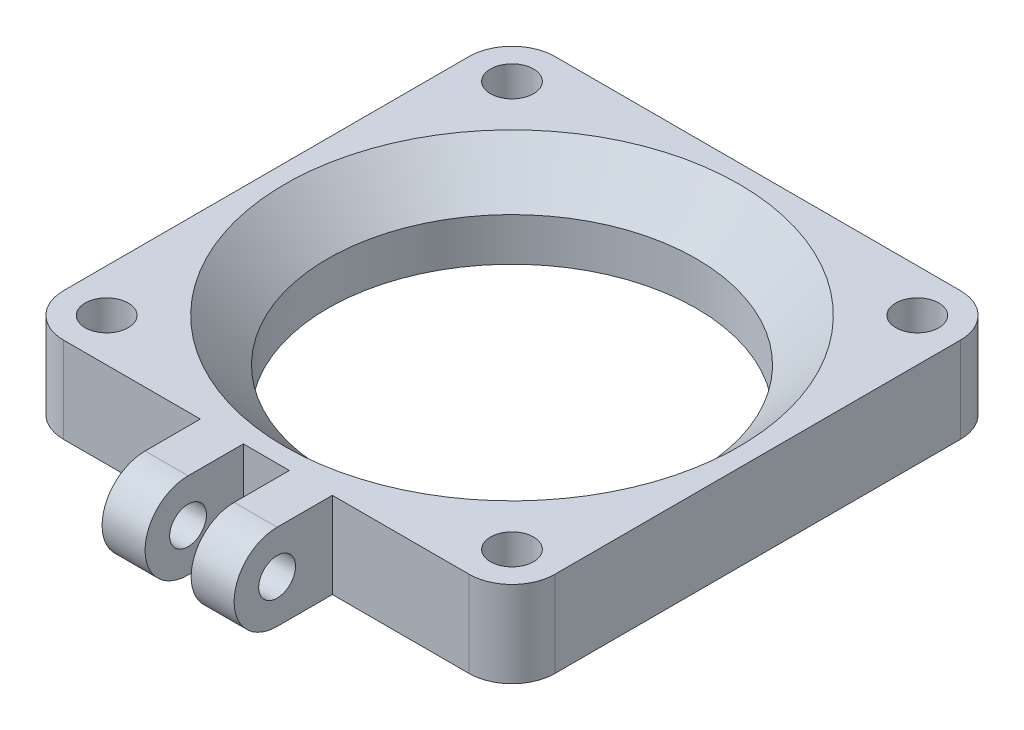
ISO-10303-21;
HEADER;
FILE_DESCRIPTION(('STEP AP214'),'2;1');
FILE_NAME('part.step','',(''),(''),'','','');
FILE_SCHEMA(('AUTOMOTIVE_DESIGN { 1 0 10303 214 1 1 1 1 }'));
ENDSEC;
DATA;
#1=APPLICATION_CONTEXT('core data for automotive mechanical design processes');
#2=APPLICATION_PROTOCOL_DEFINITION('international standard','automotive_design',2000,#1);
#3=PRODUCT_CONTEXT('',#1,'mechanical');
#4=PRODUCT('Part','Part','',(#3));
#5=PRODUCT_RELATED_PRODUCT_CATEGORY('part','',(#4));
#6=PRODUCT_DEFINITION_FORMATION('','',#4);
#7=PRODUCT_DEFINITION_CONTEXT('part definition',#1,'design');
#8=PRODUCT_DEFINITION('design','',#6,#7);
#9=PRODUCT_DEFINITION_SHAPE('','',#8);
#10=(LENGTH_UNIT() NAMED_UNIT(*) SI_UNIT(.MILLI.,.METRE.));
#11=(NAMED_UNIT(*) PLANE_ANGLE_UNIT() SI_UNIT($,.RADIAN.));
#12=(NAMED_UNIT(*) SI_UNIT($,.STERADIAN.) SOLID_ANGLE_UNIT());
#13=UNCERTAINTY_MEASURE_WITH_UNIT(LENGTH_MEASURE(1.E-05),#10,'distance_accuracy_value','');
#14=(GEOMETRIC_REPRESENTATION_CONTEXT(3) GLOBAL_UNCERTAINTY_ASSIGNED_CONTEXT((#13)) GLOBAL_UNIT_ASSIGNED_CONTEXT((#10,
#11,#12)) REPRESENTATION_CONTEXT('',''));
#15=CARTESIAN_POINT('',(0.,0.,0.));
#16=DIRECTION('',(0.,0.,1.));
#17=DIRECTION('',(1.,0.,0.));
#18=AXIS2_PLACEMENT_3D('',#15,#16,#17);
#19=CARTESIAN_POINT('',(-16.5,7.,16.5));
#20=DIRECTION('',(0.,1.,0.));
#21=DIRECTION('',(0.,0.,1.));
#22=AXIS2_PLACEMENT_3D('',#19,#20,#21);
#23=PLANE('',#22);
#24=DIRECTION('',(0.,0.,-1.));
#25=VECTOR('',#24,1.);
#26=CARTESIAN_POINT('',(-5.375,7.,0.));
#27=LINE('',#26,#25);
#28=CARTESIAN_POINT('',(-5.375,7.,24.5));
#29=VERTEX_POINT('',#28);
#30=CARTESIAN_POINT('',(-5.375,7.,20.));
#31=VERTEX_POINT('',#30);
#32=EDGE_CURVE('E212',#29,#31,#27,.T.);
#33=ORIENTED_EDGE('',*,*,#32,.F.);
#34=DIRECTION('',(1.,0.,0.));
#35=VECTOR('',#34,1.);
#36=CARTESIAN_POINT('',(-20.,7.,24.5));
#37=LINE('',#36,#35);
#38=CARTESIAN_POINT('',(-1.875,7.,24.5));
#39=VERTEX_POINT('',#38);
#40=EDGE_CURVE('E597',#29,#39,#37,.T.);
#41=ORIENTED_EDGE('',*,*,#40,.T.);
#42=DIRECTION('',(0.,0.,1.));
#43=VECTOR('',#42,1.);
#44=CARTESIAN_POINT('',(-1.875,7.,0.));
#45=LINE('',#44,#43);
#46=CARTESIAN_POINT('',(-1.875,7.,20.));
#47=VERTEX_POINT('',#46);
#48=EDGE_CURVE('E209',#47,#39,#45,.T.);
#49=ORIENTED_EDGE('',*,*,#48,.F.);
#50=DIRECTION('',(1.,0.,0.));
#51=VECTOR('',#50,1.);
#52=CARTESIAN_POINT('',(-16.5,7.,20.));
#53=LINE('',#52,#51);
#54=CARTESIAN_POINT('',(1.875,7.,20.));
#55=VERTEX_POINT('',#54);
#56=EDGE_CURVE('E257',#47,#55,#53,.T.);
#57=ORIENTED_EDGE('',*,*,#56,.T.);
#58=DIRECTION('',(0.,0.,-1.));
#59=VECTOR('',#58,1.);
#60=CARTESIAN_POINT('',(1.875,7.,0.));
#61=LINE('',#60,#59);
#62=CARTESIAN_POINT('',(1.875,7.,24.5));
#63=VERTEX_POINT('',#62);
#64=EDGE_CURVE('E78',#63,#55,#61,.T.);
#65=ORIENTED_EDGE('',*,*,#64,.F.);
#66=CARTESIAN_POINT('',(5.375,7.,24.5));
#67=VERTEX_POINT('',#66);
#68=EDGE_CURVE('E180',#63,#67,#37,.T.);
#69=ORIENTED_EDGE('',*,*,#68,.T.);
#70=DIRECTION('',(0.,0.,1.));
#71=VECTOR('',#70,1.);
#72=CARTESIAN_POINT('',(5.375,7.,0.));
#73=LINE('',#72,#71);
#74=CARTESIAN_POINT('',(5.375,7.,20.));
#75=VERTEX_POINT('',#74);
#76=EDGE_CURVE('E177',#75,#67,#73,.T.);
#77=ORIENTED_EDGE('',*,*,#76,.F.);
#78=CARTESIAN_POINT('',(16.5,7.,20.));
#79=VERTEX_POINT('',#78);
#80=EDGE_CURVE('E70',#75,#79,#53,.T.);
#81=ORIENTED_EDGE('',*,*,#80,.T.);
#82=CARTESIAN_POINT('',(16.5,7.,16.5));
#83=DIRECTION('',(0.,1.,0.));
#84=DIRECTION('',(0.,0.,1.));
#85=AXIS2_PLACEMENT_3D('',#82,#83,#84);
#86=CIRCLE('',#85,3.5);
#87=CARTESIAN_POINT('',(20.,7.,16.5));
#88=VERTEX_POINT('',#87);
#89=EDGE_CURVE('E256',#79,#88,#86,.T.);
#90=ORIENTED_EDGE('',*,*,#89,.T.);
#91=DIRECTION('',(0.,0.,-1.));
#92=VECTOR('',#91,1.);
#93=CARTESIAN_POINT('',(20.,7.,-16.5));
#94=LINE('',#93,#92);
#95=CARTESIAN_POINT('',(20.,7.,-16.5));
#96=VERTEX_POINT('',#95);
#97=EDGE_CURVE('E259',#88,#96,#94,.T.);
#98=ORIENTED_EDGE('',*,*,#97,.T.);
#99=CARTESIAN_POINT('',(16.5,7.,-16.5));
#100=DIRECTION('',(0.,1.,0.));
#101=DIRECTION('',(0.,0.,-1.));
#102=AXIS2_PLACEMENT_3D('',#99,#100,#101);
#103=CIRCLE('',#102,3.49999999999999);
#104=CARTESIAN_POINT('',(16.5,7.,-20.));
#105=VERTEX_POINT('',#104);
#106=EDGE_CURVE('E261',#96,#105,#103,.T.);
#107=ORIENTED_EDGE('',*,*,#106,.T.);
#108=DIRECTION('',(-1.,0.,0.));
#109=VECTOR('',#108,1.);
#110=CARTESIAN_POINT('',(-16.5,7.,-20.));
#111=LINE('',#110,#109);
#112=CARTESIAN_POINT('',(-16.5,7.,-20.));
#113=VERTEX_POINT('',#112);
#114=EDGE_CURVE('E263',#105,#113,#111,.T.);
#115=ORIENTED_EDGE('',*,*,#114,.T.);
#116=CARTESIAN_POINT('',(-16.5,7.,-16.5));
#117=DIRECTION('',(0.,1.,0.));
#118=DIRECTION('',(0.,0.,1.));
#119=AXIS2_PLACEMENT_3D('',#116,#117,#118);
#120=CIRCLE('',#119,3.5);
#121=CARTESIAN_POINT('',(-20.,7.,-16.5));
#122=VERTEX_POINT('',#121);
#123=EDGE_CURVE('E265',#113,#122,#120,.T.);
#124=ORIENTED_EDGE('',*,*,#123,.T.);
#125=DIRECTION('',(0.,0.,1.));
#126=VECTOR('',#125,1.);
#127=CARTESIAN_POINT('',(-20.,7.,-16.5));
#128=LINE('',#127,#126);
#129=CARTESIAN_POINT('',(-20.,7.,16.5));
#130=VERTEX_POINT('',#129);
#131=EDGE_CURVE('E267',#122,#130,#128,.T.);
#132=ORIENTED_EDGE('',*,*,#131,.T.);
#133=CARTESIAN_POINT('',(-16.5,7.,16.5));
#134=DIRECTION('',(0.,1.,0.));
#135=DIRECTION('',(0.,0.,1.));
#136=AXIS2_PLACEMENT_3D('',#133,#134,#135);
#137=CIRCLE('',#136,3.5);
#138=CARTESIAN_POINT('',(-16.5,7.,20.));
#139=VERTEX_POINT('',#138);
#140=EDGE_CURVE('E249',#130,#139,#137,.T.);
#141=ORIENTED_EDGE('',*,*,#140,.T.);
#142=EDGE_CURVE('E253',#139,#31,#53,.T.);
#143=ORIENTED_EDGE('',*,*,#142,.T.);
#144=EDGE_LOOP('',(#33,#41,#49,#57,#65,#69,#77,#81,#90,#98,#107,#115,#124,#132,#141,#143));
#145=FACE_BOUND('',#144,.T.);
#146=CARTESIAN_POINT('',(-16.5,7.,-16.5));
#147=DIRECTION('',(0.,1.,0.));
#148=DIRECTION('',(0.,0.,1.));
#149=AXIS2_PLACEMENT_3D('',#146,#147,#148);
#150=CIRCLE('',#149,1.75);
#151=CARTESIAN_POINT('',(-16.5,7.,-14.75));
#152=VERTEX_POINT('',#151);
#153=EDGE_CURVE('E242',#152,#152,#150,.T.);
#154=ORIENTED_EDGE('',*,*,#153,.F.);
#155=EDGE_LOOP('',(#154));
#156=FACE_BOUND('',#155,.T.);
#157=CARTESIAN_POINT('',(16.5,7.,-16.5));
#158=DIRECTION('',(0.,1.,0.));
#159=DIRECTION('',(0.,0.,-1.));
#160=AXIS2_PLACEMENT_3D('',#157,#158,#159);
#161=CIRCLE('',#160,1.75);
#162=CARTESIAN_POINT('',(16.5,7.,-18.25));
#163=VERTEX_POINT('',#162);
#164=EDGE_CURVE('E236',#163,#163,#161,.T.);
#165=ORIENTED_EDGE('',*,*,#164,.F.);
#166=EDGE_LOOP('',(#165));
#167=FACE_BOUND('',#166,.T.);
#168=CARTESIAN_POINT('',(16.5,7.,16.5));
#169=DIRECTION('',(0.,1.,0.));
#170=DIRECTION('',(0.,0.,1.));
#171=AXIS2_PLACEMENT_3D('',#168,#169,#170);
#172=CIRCLE('',#171,1.75);
#173=CARTESIAN_POINT('',(16.5,7.,18.25));
#174=VERTEX_POINT('',#173);
#175=EDGE_CURVE('E230',#174,#174,#172,.T.);
#176=ORIENTED_EDGE('',*,*,#175,.F.);
#177=EDGE_LOOP('',(#176));
#178=FACE_BOUND('',#177,.T.);
#179=CARTESIAN_POINT('',(-16.5,7.,16.5));
#180=DIRECTION('',(0.,1.,0.));
#181=DIRECTION('',(0.,0.,-1.));
#182=AXIS2_PLACEMENT_3D('',#179,#180,#181);
#183=CIRCLE('',#182,1.75);
#184=CARTESIAN_POINT('',(-16.5,7.,14.75));
#185=VERTEX_POINT('',#184);
#186=EDGE_CURVE('E224',#185,#185,#183,.T.);
#187=ORIENTED_EDGE('',*,*,#186,.F.);
#188=EDGE_LOOP('',(#187));
#189=FACE_BOUND('',#188,.T.);
#190=CARTESIAN_POINT('',(0.,7.,0.));
#191=DIRECTION('',(0.,1.,0.));
#192=DIRECTION('',(0.,0.,1.));
#193=AXIS2_PLACEMENT_3D('',#190,#191,#192);
#194=CIRCLE('',#193,18.5);
#195=CARTESIAN_POINT('',(0.,7.,18.5));
#196=VERTEX_POINT('',#195);
#197=EDGE_CURVE('E619',#196,#196,#194,.T.);
#198=ORIENTED_EDGE('',*,*,#197,.F.);
#199=EDGE_LOOP('',(#198));
#200=FACE_BOUND('',#199,.T.);
#201=ADVANCED_FACE('F55',(#145,#156,#167,#178,#189,#200),#23,.T.);
#202=CARTESIAN_POINT('',(0.,7.,0.));
#203=DIRECTION('',(0.,-1.,0.));
#204=DIRECTION('',(0.,0.,-1.));
#205=AXIS2_PLACEMENT_3D('',#202,#203,#204);
#206=CYLINDRICAL_SURFACE('',#205,15.);
#207=CARTESIAN_POINT('',(0.,0.,0.));
#208=DIRECTION('',(0.,-1.,0.));
#209=DIRECTION('',(0.,0.,-1.));
#210=AXIS2_PLACEMENT_3D('',#207,#208,#209);
#211=CIRCLE('',#210,15.);
#212=CARTESIAN_POINT('',(0.,0.,-15.));
#213=VERTEX_POINT('',#212);
#214=EDGE_CURVE('E616',#213,#213,#211,.T.);
#215=ORIENTED_EDGE('',*,*,#214,.T.);
#216=EDGE_LOOP('',(#215));
#217=FACE_BOUND('',#216,.T.);
#218=CARTESIAN_POINT('',(0.,3.5,0.));
#219=DIRECTION('',(0.,1.,0.));
#220=DIRECTION('',(0.,0.,1.));
#221=AXIS2_PLACEMENT_3D('',#218,#219,#220);
#222=CIRCLE('',#221,15.);
#223=CARTESIAN_POINT('',(0.,3.5,15.));
#224=VERTEX_POINT('',#223);
#225=EDGE_CURVE('E622',#224,#224,#222,.T.);
#226=ORIENTED_EDGE('',*,*,#225,.T.);
#227=EDGE_LOOP('',(#226));
#228=FACE_BOUND('',#227,.T.);
#229=ADVANCED_FACE('F348',(#217,#228),#206,.F.);
#230=CARTESIAN_POINT('',(-1.875,7.,0.));
#231=DIRECTION('',(1.,0.,0.));
#232=DIRECTION('',(0.,0.,-1.));
#233=AXIS2_PLACEMENT_3D('',#230,#231,#232);
#234=PLANE('',#233);
#235=CARTESIAN_POINT('',(-1.875,3.5,24.5));
#236=DIRECTION('',(1.,0.,0.));
#237=DIRECTION('',(0.,0.,-1.));
#238=AXIS2_PLACEMENT_3D('',#235,#236,#237);
#239=CIRCLE('',#238,1.5);
#240=CARTESIAN_POINT('',(-1.875,3.5,23.));
#241=VERTEX_POINT('',#240);
#242=EDGE_CURVE('E189',#241,#241,#239,.T.);
#243=ORIENTED_EDGE('',*,*,#242,.F.);
#244=EDGE_LOOP('',(#243));
#245=FACE_BOUND('',#244,.T.);
#246=CARTESIAN_POINT('',(-1.875,3.5,24.5));
#247=DIRECTION('',(1.,0.,0.));
#248=DIRECTION('',(0.,0.,-1.));
#249=AXIS2_PLACEMENT_3D('',#246,#247,#248);
#250=CIRCLE('',#249,3.5);
#251=CARTESIAN_POINT('',(-1.875,0.,24.5));
#252=VERTEX_POINT('',#251);
#253=EDGE_CURVE('E196',#39,#252,#250,.T.);
#254=ORIENTED_EDGE('',*,*,#253,.T.);
#255=DIRECTION('',(0.,0.,1.));
#256=VECTOR('',#255,1.);
#257=CARTESIAN_POINT('',(-1.875,0.,0.));
#258=LINE('',#257,#256);
#259=CARTESIAN_POINT('',(-1.875,0.,20.));
#260=VERTEX_POINT('',#259);
#261=EDGE_CURVE('E208',#260,#252,#258,.T.);
#262=ORIENTED_EDGE('',*,*,#261,.F.);
#263=DIRECTION('',(0.,-1.,0.));
#264=VECTOR('',#263,1.);
#265=CARTESIAN_POINT('',(-1.875,7.,20.));
#266=LINE('',#265,#264);
#267=EDGE_CURVE('E221',#47,#260,#266,.T.);
#268=ORIENTED_EDGE('',*,*,#267,.F.);
#269=ORIENTED_EDGE('',*,*,#48,.T.);
#270=EDGE_LOOP('',(#254,#262,#268,#269));
#271=FACE_BOUND('',#270,.T.);
#272=ADVANCED_FACE('F333',(#245,#271),#234,.T.);
#273=CARTESIAN_POINT('',(-5.375,7.,0.));
#274=DIRECTION('',(-1.,0.,0.));
#275=DIRECTION('',(0.,0.,1.));
#276=AXIS2_PLACEMENT_3D('',#273,#274,#275);
#277=PLANE('',#276);
#278=CARTESIAN_POINT('',(-5.375,3.5,24.5));
#279=DIRECTION('',(-1.,0.,0.));
#280=DIRECTION('',(0.,0.,1.));
#281=AXIS2_PLACEMENT_3D('',#278,#279,#280);
#282=CIRCLE('',#281,1.5);
#283=CARTESIAN_POINT('',(-5.375,3.5,26.));
#284=VERTEX_POINT('',#283);
#285=EDGE_CURVE('E589',#284,#284,#282,.T.);
#286=ORIENTED_EDGE('',*,*,#285,.F.);
#287=EDGE_LOOP('',(#286));
#288=FACE_BOUND('',#287,.T.);
#289=DIRECTION('',(0.,0.,-1.));
#290=VECTOR('',#289,1.);
#291=CARTESIAN_POINT('',(-5.375,0.,0.));
#292=LINE('',#291,#290);
#293=CARTESIAN_POINT('',(-5.375,0.,24.5));
#294=VERTEX_POINT('',#293);
#295=CARTESIAN_POINT('',(-5.375,0.,20.));
#296=VERTEX_POINT('',#295);
#297=EDGE_CURVE('E213',#294,#296,#292,.T.);
#298=ORIENTED_EDGE('',*,*,#297,.F.);
#299=CARTESIAN_POINT('',(-5.375,3.5,24.5));
#300=DIRECTION('',(-1.,0.,0.));
#301=DIRECTION('',(0.,0.,1.));
#302=AXIS2_PLACEMENT_3D('',#299,#300,#301);
#303=CIRCLE('',#302,3.5);
#304=EDGE_CURVE('E199',#294,#29,#303,.T.);
#305=ORIENTED_EDGE('',*,*,#304,.T.);
#306=ORIENTED_EDGE('',*,*,#32,.T.);
#307=DIRECTION('',(0.,1.,0.));
#308=VECTOR('',#307,1.);
#309=CARTESIAN_POINT('',(-5.375,7.,20.));
#310=LINE('',#309,#308);
#311=EDGE_CURVE('E215',#296,#31,#310,.T.);
#312=ORIENTED_EDGE('',*,*,#311,.F.);
#313=EDGE_LOOP('',(#298,#305,#306,#312));
#314=FACE_BOUND('',#313,.T.);
#315=ADVANCED_FACE('F549',(#288,#314),#277,.T.);
#316=CARTESIAN_POINT('',(1.875,7.,0.));
#317=DIRECTION('',(-1.,0.,0.));
#318=DIRECTION('',(0.,0.,1.));
#319=AXIS2_PLACEMENT_3D('',#316,#317,#318);
#320=PLANE('',#319);
#321=CARTESIAN_POINT('',(1.875,3.5,24.5));
#322=DIRECTION('',(-1.,0.,0.));
#323=DIRECTION('',(0.,0.,1.));
#324=AXIS2_PLACEMENT_3D('',#321,#322,#323);
#325=CIRCLE('',#324,1.5);
#326=CARTESIAN_POINT('',(1.875,3.5,26.));
#327=VERTEX_POINT('',#326);
#328=EDGE_CURVE('E592',#327,#327,#325,.T.);
#329=ORIENTED_EDGE('',*,*,#328,.F.);
#330=EDGE_LOOP('',(#329));
#331=FACE_BOUND('',#330,.T.);
#332=DIRECTION('',(0.,0.,-1.));
#333=VECTOR('',#332,1.);
#334=CARTESIAN_POINT('',(1.875,0.,0.));
#335=LINE('',#334,#333);
#336=CARTESIAN_POINT('',(1.875,0.,24.5));
#337=VERTEX_POINT('',#336);
#338=CARTESIAN_POINT('',(1.875,0.,20.));
#339=VERTEX_POINT('',#338);
#340=EDGE_CURVE('E195',#337,#339,#335,.T.);
#341=ORIENTED_EDGE('',*,*,#340,.F.);
#342=CARTESIAN_POINT('',(1.875,3.5,24.5));
#343=DIRECTION('',(-1.,0.,0.));
#344=DIRECTION('',(0.,0.,1.));
#345=AXIS2_PLACEMENT_3D('',#342,#343,#344);
#346=CIRCLE('',#345,3.5);
#347=EDGE_CURVE('E186',#337,#63,#346,.T.);
#348=ORIENTED_EDGE('',*,*,#347,.T.);
#349=ORIENTED_EDGE('',*,*,#64,.T.);
#350=DIRECTION('',(0.,1.,0.));
#351=VECTOR('',#350,1.);
#352=CARTESIAN_POINT('',(1.875,7.,20.));
#353=LINE('',#352,#351);
#354=EDGE_CURVE('E206',#339,#55,#353,.T.);
#355=ORIENTED_EDGE('',*,*,#354,.F.);
#356=EDGE_LOOP('',(#341,#348,#349,#355));
#357=FACE_BOUND('',#356,.T.);
#358=ADVANCED_FACE('F542',(#331,#357),#320,.T.);
#359=CARTESIAN_POINT('',(5.375,7.,0.));
#360=DIRECTION('',(1.,0.,0.));
#361=DIRECTION('',(0.,0.,-1.));
#362=AXIS2_PLACEMENT_3D('',#359,#360,#361);
#363=PLANE('',#362);
#364=CARTESIAN_POINT('',(5.375,3.5,24.5));
#365=DIRECTION('',(1.,0.,0.));
#366=DIRECTION('',(0.,0.,-1.));
#367=AXIS2_PLACEMENT_3D('',#364,#365,#366);
#368=CIRCLE('',#367,1.5);
#369=CARTESIAN_POINT('',(5.375,3.5,23.));
#370=VERTEX_POINT('',#369);
#371=EDGE_CURVE('E613',#370,#370,#368,.T.);
#372=ORIENTED_EDGE('',*,*,#371,.F.);
#373=EDGE_LOOP('',(#372));
#374=FACE_BOUND('',#373,.T.);
#375=CARTESIAN_POINT('',(5.375,3.5,24.5));
#376=DIRECTION('',(1.,0.,0.));
#377=DIRECTION('',(0.,0.,-1.));
#378=AXIS2_PLACEMENT_3D('',#375,#376,#377);
#379=CIRCLE('',#378,3.5);
#380=CARTESIAN_POINT('',(5.375,0.,24.5));
#381=VERTEX_POINT('',#380);
#382=EDGE_CURVE('E171',#67,#381,#379,.T.);
#383=ORIENTED_EDGE('',*,*,#382,.T.);
#384=DIRECTION('',(0.,0.,1.));
#385=VECTOR('',#384,1.);
#386=CARTESIAN_POINT('',(5.375,0.,0.));
#387=LINE('',#386,#385);
#388=CARTESIAN_POINT('',(5.375,0.,20.));
#389=VERTEX_POINT('',#388);
#390=EDGE_CURVE('E175',#389,#381,#387,.T.);
#391=ORIENTED_EDGE('',*,*,#390,.F.);
#392=DIRECTION('',(0.,-1.,0.));
#393=VECTOR('',#392,1.);
#394=CARTESIAN_POINT('',(5.375,7.,20.));
#395=LINE('',#394,#393);
#396=EDGE_CURVE('E204',#75,#389,#395,.T.);
#397=ORIENTED_EDGE('',*,*,#396,.F.);
#398=ORIENTED_EDGE('',*,*,#76,.T.);
#399=EDGE_LOOP('',(#383,#391,#397,#398));
#400=FACE_BOUND('',#399,.T.);
#401=ADVANCED_FACE('F173',(#374,#400),#363,.T.);
#402=CARTESIAN_POINT('',(-16.5,0.,16.5));
#403=DIRECTION('',(0.,1.,0.));
#404=DIRECTION('',(0.,0.,1.));
#405=AXIS2_PLACEMENT_3D('',#402,#403,#404);
#406=PLANE('',#405);
#407=ORIENTED_EDGE('',*,*,#214,.F.);
#408=EDGE_LOOP('',(#407));
#409=FACE_BOUND('',#408,.T.);
#410=CARTESIAN_POINT('',(-16.5,0.,16.5));
#411=DIRECTION('',(0.,1.,0.));
#412=DIRECTION('',(0.,0.,1.));
#413=AXIS2_PLACEMENT_3D('',#410,#411,#412);
#414=CIRCLE('',#413,1.75);
#415=CARTESIAN_POINT('',(-16.5,0.,18.25));
#416=VERTEX_POINT('',#415);
#417=EDGE_CURVE('E227',#416,#416,#414,.F.);
#418=ORIENTED_EDGE('',*,*,#417,.F.);
#419=EDGE_LOOP('',(#418));
#420=FACE_BOUND('',#419,.T.);
#421=CARTESIAN_POINT('',(16.5,0.,16.5));
#422=DIRECTION('',(0.,1.,0.));
#423=DIRECTION('',(0.,0.,1.));
#424=AXIS2_PLACEMENT_3D('',#421,#422,#423);
#425=CIRCLE('',#424,1.75);
#426=CARTESIAN_POINT('',(16.5,0.,18.25));
#427=VERTEX_POINT('',#426);
#428=EDGE_CURVE('E233',#427,#427,#425,.F.);
#429=ORIENTED_EDGE('',*,*,#428,.F.);
#430=EDGE_LOOP('',(#429));
#431=FACE_BOUND('',#430,.T.);
#432=CARTESIAN_POINT('',(16.5,0.,-16.5));
#433=DIRECTION('',(0.,1.,0.));
#434=DIRECTION('',(0.,0.,1.));
#435=AXIS2_PLACEMENT_3D('',#432,#433,#434);
#436=CIRCLE('',#435,1.75);
#437=CARTESIAN_POINT('',(16.5,0.,-14.75));
#438=VERTEX_POINT('',#437);
#439=EDGE_CURVE('E239',#438,#438,#436,.F.);
#440=ORIENTED_EDGE('',*,*,#439,.F.);
#441=EDGE_LOOP('',(#440));
#442=FACE_BOUND('',#441,.T.);
#443=CARTESIAN_POINT('',(-16.5,0.,-16.5));
#444=DIRECTION('',(0.,1.,0.));
#445=DIRECTION('',(0.,0.,1.));
#446=AXIS2_PLACEMENT_3D('',#443,#444,#445);
#447=CIRCLE('',#446,1.75);
#448=CARTESIAN_POINT('',(-16.5,0.,-14.75));
#449=VERTEX_POINT('',#448);
#450=EDGE_CURVE('E245',#449,#449,#447,.F.);
#451=ORIENTED_EDGE('',*,*,#450,.F.);
#452=EDGE_LOOP('',(#451));
#453=FACE_BOUND('',#452,.T.);
#454=DIRECTION('',(1.,0.,0.));
#455=VECTOR('',#454,1.);
#456=CARTESIAN_POINT('',(-20.,0.,24.5));
#457=LINE('',#456,#455);
#458=EDGE_CURVE('E181',#294,#252,#457,.T.);
#459=ORIENTED_EDGE('',*,*,#458,.F.);
#460=ORIENTED_EDGE('',*,*,#297,.T.);
#461=DIRECTION('',(1.,0.,0.));
#462=VECTOR('',#461,1.);
#463=CARTESIAN_POINT('',(-16.5,0.,20.));
#464=LINE('',#463,#462);
#465=CARTESIAN_POINT('',(-16.5,0.,20.));
#466=VERTEX_POINT('',#465);
#467=EDGE_CURVE('E272',#466,#296,#464,.T.);
#468=ORIENTED_EDGE('',*,*,#467,.F.);
#469=CARTESIAN_POINT('',(-16.5,0.,16.5));
#470=DIRECTION('',(0.,1.,0.));
#471=DIRECTION('',(0.,0.,1.));
#472=AXIS2_PLACEMENT_3D('',#469,#470,#471);
#473=CIRCLE('',#472,3.5);
#474=CARTESIAN_POINT('',(-20.,0.,16.5));
#475=VERTEX_POINT('',#474);
#476=EDGE_CURVE('E248',#475,#466,#473,.T.);
#477=ORIENTED_EDGE('',*,*,#476,.F.);
#478=DIRECTION('',(0.,0.,1.));
#479=VECTOR('',#478,1.);
#480=CARTESIAN_POINT('',(-20.,0.,-16.5));
#481=LINE('',#480,#479);
#482=CARTESIAN_POINT('',(-20.,0.,-16.5));
#483=VERTEX_POINT('',#482);
#484=EDGE_CURVE('E252',#483,#475,#481,.T.);
#485=ORIENTED_EDGE('',*,*,#484,.F.);
#486=CARTESIAN_POINT('',(-16.5,0.,-16.5));
#487=DIRECTION('',(0.,1.,0.));
#488=DIRECTION('',(0.,0.,1.));
#489=AXIS2_PLACEMENT_3D('',#486,#487,#488);
#490=CIRCLE('',#489,3.5);
#491=CARTESIAN_POINT('',(-16.5,0.,-20.));
#492=VERTEX_POINT('',#491);
#493=EDGE_CURVE('E284',#492,#483,#490,.T.);
#494=ORIENTED_EDGE('',*,*,#493,.F.);
#495=DIRECTION('',(-1.,0.,0.));
#496=VECTOR('',#495,1.);
#497=CARTESIAN_POINT('',(-16.5,0.,-20.));
#498=LINE('',#497,#496);
#499=CARTESIAN_POINT('',(16.5,0.,-20.));
#500=VERTEX_POINT('',#499);
#501=EDGE_CURVE('E282',#500,#492,#498,.T.);
#502=ORIENTED_EDGE('',*,*,#501,.F.);
#503=CARTESIAN_POINT('',(16.5,0.,-16.5));
#504=DIRECTION('',(0.,1.,0.));
#505=DIRECTION('',(0.,0.,-1.));
#506=AXIS2_PLACEMENT_3D('',#503,#504,#505);
#507=CIRCLE('',#506,3.49999999999999);
#508=CARTESIAN_POINT('',(20.,0.,-16.5));
#509=VERTEX_POINT('',#508);
#510=EDGE_CURVE('E280',#509,#500,#507,.T.);
#511=ORIENTED_EDGE('',*,*,#510,.F.);
#512=DIRECTION('',(0.,0.,-1.));
#513=VECTOR('',#512,1.);
#514=CARTESIAN_POINT('',(20.,0.,-16.5));
#515=LINE('',#514,#513);
#516=CARTESIAN_POINT('',(20.,0.,16.5));
#517=VERTEX_POINT('',#516);
#518=EDGE_CURVE('E278',#517,#509,#515,.T.);
#519=ORIENTED_EDGE('',*,*,#518,.F.);
#520=CARTESIAN_POINT('',(16.5,0.,16.5));
#521=DIRECTION('',(0.,1.,0.));
#522=DIRECTION('',(0.,0.,1.));
#523=AXIS2_PLACEMENT_3D('',#520,#521,#522);
#524=CIRCLE('',#523,3.5);
#525=CARTESIAN_POINT('',(16.5,0.,20.));
#526=VERTEX_POINT('',#525);
#527=EDGE_CURVE('E275',#526,#517,#524,.T.);
#528=ORIENTED_EDGE('',*,*,#527,.F.);
#529=EDGE_CURVE('E194',#389,#526,#464,.T.);
#530=ORIENTED_EDGE('',*,*,#529,.F.);
#531=ORIENTED_EDGE('',*,*,#390,.T.);
#532=EDGE_CURVE('E184',#337,#381,#457,.T.);
#533=ORIENTED_EDGE('',*,*,#532,.F.);
#534=ORIENTED_EDGE('',*,*,#340,.T.);
#535=EDGE_CURVE('E276',#260,#339,#464,.T.);
#536=ORIENTED_EDGE('',*,*,#535,.F.);
#537=ORIENTED_EDGE('',*,*,#261,.T.);
#538=EDGE_LOOP('',(#459,#460,#468,#477,#485,#494,#502,#511,#519,#528,#530,#531,#533,#534,#536,#537));
#539=FACE_BOUND('',#538,.T.);
#540=ADVANCED_FACE('F192',(#409,#420,#431,#442,#453,#539),#406,.F.);
#541=CARTESIAN_POINT('',(-16.5,7.,20.));
#542=DIRECTION('',(0.,0.,-1.));
#543=DIRECTION('',(-1.,0.,0.));
#544=AXIS2_PLACEMENT_3D('',#541,#542,#543);
#545=PLANE('',#544);
#546=ORIENTED_EDGE('',*,*,#535,.T.);
#547=ORIENTED_EDGE('',*,*,#354,.T.);
#548=ORIENTED_EDGE('',*,*,#56,.F.);
#549=ORIENTED_EDGE('',*,*,#267,.T.);
#550=EDGE_LOOP('',(#546,#547,#548,#549));
#551=FACE_BOUND('',#550,.T.);
#552=ADVANCED_FACE('F330',(#551),#545,.F.);
#553=ORIENTED_EDGE('',*,*,#80,.F.);
#554=ORIENTED_EDGE('',*,*,#396,.T.);
#555=ORIENTED_EDGE('',*,*,#529,.T.);
#556=DIRECTION('',(0.,-1.,0.));
#557=VECTOR('',#556,1.);
#558=CARTESIAN_POINT('',(16.5,7.,20.));
#559=LINE('',#558,#557);
#560=EDGE_CURVE('E63',#79,#526,#559,.T.);
#561=ORIENTED_EDGE('',*,*,#560,.F.);
#562=EDGE_LOOP('',(#553,#554,#555,#561));
#563=FACE_BOUND('',#562,.T.);
#564=ADVANCED_FACE('F336',(#563),#545,.F.);
#565=CARTESIAN_POINT('',(-16.5,7.,16.5));
#566=DIRECTION('',(0.,-1.,0.));
#567=DIRECTION('',(0.,0.,-1.));
#568=AXIS2_PLACEMENT_3D('',#565,#566,#567);
#569=CYLINDRICAL_SURFACE('',#568,3.5);
#570=ORIENTED_EDGE('',*,*,#476,.T.);
#571=DIRECTION('',(0.,-1.,0.));
#572=VECTOR('',#571,1.);
#573=CARTESIAN_POINT('',(-16.5,7.,20.));
#574=LINE('',#573,#572);
#575=EDGE_CURVE('E12',#139,#466,#574,.T.);
#576=ORIENTED_EDGE('',*,*,#575,.F.);
#577=ORIENTED_EDGE('',*,*,#140,.F.);
#578=DIRECTION('',(0.,-1.,0.));
#579=VECTOR('',#578,1.);
#580=CARTESIAN_POINT('',(-20.,7.,16.5));
#581=LINE('',#580,#579);
#582=EDGE_CURVE('E269',#130,#475,#581,.T.);
#583=ORIENTED_EDGE('',*,*,#582,.T.);
#584=EDGE_LOOP('',(#570,#576,#577,#583));
#585=FACE_BOUND('',#584,.T.);
#586=ADVANCED_FACE('F57',(#585),#569,.T.);
#587=ORIENTED_EDGE('',*,*,#467,.T.);
#588=ORIENTED_EDGE('',*,*,#311,.T.);
#589=ORIENTED_EDGE('',*,*,#142,.F.);
#590=ORIENTED_EDGE('',*,*,#575,.T.);
#591=EDGE_LOOP('',(#587,#588,#589,#590));
#592=FACE_BOUND('',#591,.T.);
#593=ADVANCED_FACE('F338',(#592),#545,.F.);
#594=CARTESIAN_POINT('',(16.5,7.,16.5));
#595=DIRECTION('',(0.,-1.,0.));
#596=DIRECTION('',(0.,0.,-1.));
#597=AXIS2_PLACEMENT_3D('',#594,#595,#596);
#598=CYLINDRICAL_SURFACE('',#597,3.5);
#599=ORIENTED_EDGE('',*,*,#527,.T.);
#600=DIRECTION('',(0.,-1.,0.));
#601=VECTOR('',#600,1.);
#602=CARTESIAN_POINT('',(20.,7.,16.5));
#603=LINE('',#602,#601);
#604=EDGE_CURVE('E301',#88,#517,#603,.T.);
#605=ORIENTED_EDGE('',*,*,#604,.F.);
#606=ORIENTED_EDGE('',*,*,#89,.F.);
#607=ORIENTED_EDGE('',*,*,#560,.T.);
#608=EDGE_LOOP('',(#599,#605,#606,#607));
#609=FACE_BOUND('',#608,.T.);
#610=ADVANCED_FACE('F306',(#609),#598,.T.);
#611=CARTESIAN_POINT('',(20.,7.,-16.5));
#612=DIRECTION('',(-1.,0.,0.));
#613=DIRECTION('',(0.,0.,1.));
#614=AXIS2_PLACEMENT_3D('',#611,#612,#613);
#615=PLANE('',#614);
#616=ORIENTED_EDGE('',*,*,#518,.T.);
#617=DIRECTION('',(0.,-1.,0.));
#618=VECTOR('',#617,1.);
#619=CARTESIAN_POINT('',(20.,7.,-16.5));
#620=LINE('',#619,#618);
#621=EDGE_CURVE('E298',#96,#509,#620,.T.);
#622=ORIENTED_EDGE('',*,*,#621,.F.);
#623=ORIENTED_EDGE('',*,*,#97,.F.);
#624=ORIENTED_EDGE('',*,*,#604,.T.);
#625=EDGE_LOOP('',(#616,#622,#623,#624));
#626=FACE_BOUND('',#625,.T.);
#627=ADVANCED_FACE('F313',(#626),#615,.F.);
#628=CARTESIAN_POINT('',(16.5,7.,-16.5));
#629=DIRECTION('',(0.,-1.,0.));
#630=DIRECTION('',(0.,0.,-1.));
#631=AXIS2_PLACEMENT_3D('',#628,#629,#630);
#632=CYLINDRICAL_SURFACE('',#631,3.49999999999999);
#633=ORIENTED_EDGE('',*,*,#510,.T.);
#634=DIRECTION('',(0.,-1.,0.));
#635=VECTOR('',#634,1.);
#636=CARTESIAN_POINT('',(16.5,7.,-20.));
#637=LINE('',#636,#635);
#638=EDGE_CURVE('E295',#105,#500,#637,.T.);
#639=ORIENTED_EDGE('',*,*,#638,.F.);
#640=ORIENTED_EDGE('',*,*,#106,.F.);
#641=ORIENTED_EDGE('',*,*,#621,.T.);
#642=EDGE_LOOP('',(#633,#639,#640,#641));
#643=FACE_BOUND('',#642,.T.);
#644=ADVANCED_FACE('F317',(#643),#632,.T.);
#645=CARTESIAN_POINT('',(-16.5,7.,-20.));
#646=DIRECTION('',(0.,0.,1.));
#647=DIRECTION('',(1.,0.,0.));
#648=AXIS2_PLACEMENT_3D('',#645,#646,#647);
#649=PLANE('',#648);
#650=ORIENTED_EDGE('',*,*,#501,.T.);
#651=DIRECTION('',(0.,-1.,0.));
#652=VECTOR('',#651,1.);
#653=CARTESIAN_POINT('',(-16.5,7.,-20.));
#654=LINE('',#653,#652);
#655=EDGE_CURVE('E292',#113,#492,#654,.T.);
#656=ORIENTED_EDGE('',*,*,#655,.F.);
#657=ORIENTED_EDGE('',*,*,#114,.F.);
#658=ORIENTED_EDGE('',*,*,#638,.T.);
#659=EDGE_LOOP('',(#650,#656,#657,#658));
#660=FACE_BOUND('',#659,.T.);
#661=ADVANCED_FACE('F369',(#660),#649,.F.);
#662=CARTESIAN_POINT('',(-16.5,7.,-16.5));
#663=DIRECTION('',(0.,-1.,0.));
#664=DIRECTION('',(0.,0.,-1.));
#665=AXIS2_PLACEMENT_3D('',#662,#663,#664);
#666=CYLINDRICAL_SURFACE('',#665,3.5);
#667=ORIENTED_EDGE('',*,*,#493,.T.);
#668=DIRECTION('',(0.,-1.,0.));
#669=VECTOR('',#668,1.);
#670=CARTESIAN_POINT('',(-20.,7.,-16.5));
#671=LINE('',#670,#669);
#672=EDGE_CURVE('E289',#122,#483,#671,.T.);
#673=ORIENTED_EDGE('',*,*,#672,.F.);
#674=ORIENTED_EDGE('',*,*,#123,.F.);
#675=ORIENTED_EDGE('',*,*,#655,.T.);
#676=EDGE_LOOP('',(#667,#673,#674,#675));
#677=FACE_BOUND('',#676,.T.);
#678=ADVANCED_FACE('F365',(#677),#666,.T.);
#679=CARTESIAN_POINT('',(-20.,7.,-16.5));
#680=DIRECTION('',(1.,0.,0.));
#681=DIRECTION('',(0.,0.,-1.));
#682=AXIS2_PLACEMENT_3D('',#679,#680,#681);
#683=PLANE('',#682);
#684=ORIENTED_EDGE('',*,*,#484,.T.);
#685=ORIENTED_EDGE('',*,*,#582,.F.);
#686=ORIENTED_EDGE('',*,*,#131,.F.);
#687=ORIENTED_EDGE('',*,*,#672,.T.);
#688=EDGE_LOOP('',(#684,#685,#686,#687));
#689=FACE_BOUND('',#688,.T.);
#690=ADVANCED_FACE('F362',(#689),#683,.F.);
#691=CARTESIAN_POINT('',(-16.5,-0.00100000000000013,-16.5));
#692=DIRECTION('',(0.,1.,0.));
#693=DIRECTION('',(0.,0.,1.));
#694=AXIS2_PLACEMENT_3D('',#691,#692,#693);
#695=CYLINDRICAL_SURFACE('',#694,1.75);
#696=ORIENTED_EDGE('',*,*,#153,.T.);
#697=EDGE_LOOP('',(#696));
#698=FACE_BOUND('',#697,.T.);
#699=ORIENTED_EDGE('',*,*,#450,.T.);
#700=EDGE_LOOP('',(#699));
#701=FACE_BOUND('',#700,.T.);
#702=ADVANCED_FACE('F357',(#698,#701),#695,.F.);
#703=CARTESIAN_POINT('',(16.5,-0.00100000000000013,-16.5));
#704=DIRECTION('',(0.,1.,0.));
#705=DIRECTION('',(0.,0.,1.));
#706=AXIS2_PLACEMENT_3D('',#703,#704,#705);
#707=CYLINDRICAL_SURFACE('',#706,1.75);
#708=ORIENTED_EDGE('',*,*,#164,.T.);
#709=EDGE_LOOP('',(#708));
#710=FACE_BOUND('',#709,.T.);
#711=ORIENTED_EDGE('',*,*,#439,.T.);
#712=EDGE_LOOP('',(#711));
#713=FACE_BOUND('',#712,.T.);
#714=ADVANCED_FACE('F409',(#710,#713),#707,.F.);
#715=CARTESIAN_POINT('',(16.5,-0.00100000000000013,16.5));
#716=DIRECTION('',(0.,1.,0.));
#717=DIRECTION('',(0.,0.,1.));
#718=AXIS2_PLACEMENT_3D('',#715,#716,#717);
#719=CYLINDRICAL_SURFACE('',#718,1.75);
#720=ORIENTED_EDGE('',*,*,#175,.T.);
#721=EDGE_LOOP('',(#720));
#722=FACE_BOUND('',#721,.T.);
#723=ORIENTED_EDGE('',*,*,#428,.T.);
#724=EDGE_LOOP('',(#723));
#725=FACE_BOUND('',#724,.T.);
#726=ADVANCED_FACE('F416',(#722,#725),#719,.F.);
#727=CARTESIAN_POINT('',(-16.5,-0.00100000000000013,16.5));
#728=DIRECTION('',(0.,1.,0.));
#729=DIRECTION('',(0.,0.,1.));
#730=AXIS2_PLACEMENT_3D('',#727,#728,#729);
#731=CYLINDRICAL_SURFACE('',#730,1.75);
#732=ORIENTED_EDGE('',*,*,#186,.T.);
#733=EDGE_LOOP('',(#732));
#734=FACE_BOUND('',#733,.T.);
#735=ORIENTED_EDGE('',*,*,#417,.T.);
#736=EDGE_LOOP('',(#735));
#737=FACE_BOUND('',#736,.T.);
#738=ADVANCED_FACE('F423',(#734,#737),#731,.F.);
#739=CARTESIAN_POINT('',(-20.,3.5,24.5));
#740=DIRECTION('',(1.,0.,0.));
#741=DIRECTION('',(0.,0.,-1.));
#742=AXIS2_PLACEMENT_3D('',#739,#740,#741);
#743=CYLINDRICAL_SURFACE('',#742,3.5);
#744=ORIENTED_EDGE('',*,*,#347,.F.);
#745=ORIENTED_EDGE('',*,*,#532,.T.);
#746=ORIENTED_EDGE('',*,*,#382,.F.);
#747=ORIENTED_EDGE('',*,*,#68,.F.);
#748=EDGE_LOOP('',(#744,#745,#746,#747));
#749=FACE_BOUND('',#748,.T.);
#750=ADVANCED_FACE('F185',(#749),#743,.T.);
#751=ORIENTED_EDGE('',*,*,#40,.F.);
#752=ORIENTED_EDGE('',*,*,#304,.F.);
#753=ORIENTED_EDGE('',*,*,#458,.T.);
#754=ORIENTED_EDGE('',*,*,#253,.F.);
#755=EDGE_LOOP('',(#751,#752,#753,#754));
#756=FACE_BOUND('',#755,.T.);
#757=ADVANCED_FACE('F439',(#756),#743,.T.);
#758=CARTESIAN_POINT('',(-20.,3.5,24.5));
#759=DIRECTION('',(1.,0.,0.));
#760=DIRECTION('',(0.,0.,-1.));
#761=AXIS2_PLACEMENT_3D('',#758,#759,#760);
#762=CYLINDRICAL_SURFACE('',#761,1.5);
#763=ORIENTED_EDGE('',*,*,#328,.T.);
#764=EDGE_LOOP('',(#763));
#765=FACE_BOUND('',#764,.T.);
#766=ORIENTED_EDGE('',*,*,#371,.T.);
#767=EDGE_LOOP('',(#766));
#768=FACE_BOUND('',#767,.T.);
#769=ADVANCED_FACE('F446',(#765,#768),#762,.F.);
#770=ORIENTED_EDGE('',*,*,#242,.T.);
#771=EDGE_LOOP('',(#770));
#772=FACE_BOUND('',#771,.T.);
#773=ORIENTED_EDGE('',*,*,#285,.T.);
#774=EDGE_LOOP('',(#773));
#775=FACE_BOUND('',#774,.T.);
#776=ADVANCED_FACE('F454',(#772,#775),#762,.F.);
#777=CARTESIAN_POINT('',(0.,3.5,0.));
#778=DIRECTION('',(0.,1.,0.));
#779=DIRECTION('',(0.,0.,1.));
#780=AXIS2_PLACEMENT_3D('',#777,#778,#779);
#781=CONICAL_SURFACE('',#780,15.,0.785398163397453);
#782=ORIENTED_EDGE('',*,*,#197,.T.);
#783=EDGE_LOOP('',(#782));
#784=FACE_BOUND('',#783,.T.);
#785=ORIENTED_EDGE('',*,*,#225,.F.);
#786=EDGE_LOOP('',(#785));
#787=FACE_BOUND('',#786,.T.);
#788=ADVANCED_FACE('F463',(#784,#787),#781,.F.);
#789=CLOSED_SHELL('',(#201,#229,#272,#315,#358,#401,#540,#552,#564,#586,#593,#610,#627,#644,
#661,#678,#690,#702,#714,#726,#738,#750,#757,#769,#776,#788));
#790=MANIFOLD_SOLID_BREP('B2',#789);
#791=ADVANCED_BREP_SHAPE_REPRESENTATION('',(#18,#790),#14);
#792=SHAPE_DEFINITION_REPRESENTATION(#9,#791);
ENDSEC;
END-ISO-10303-21;
